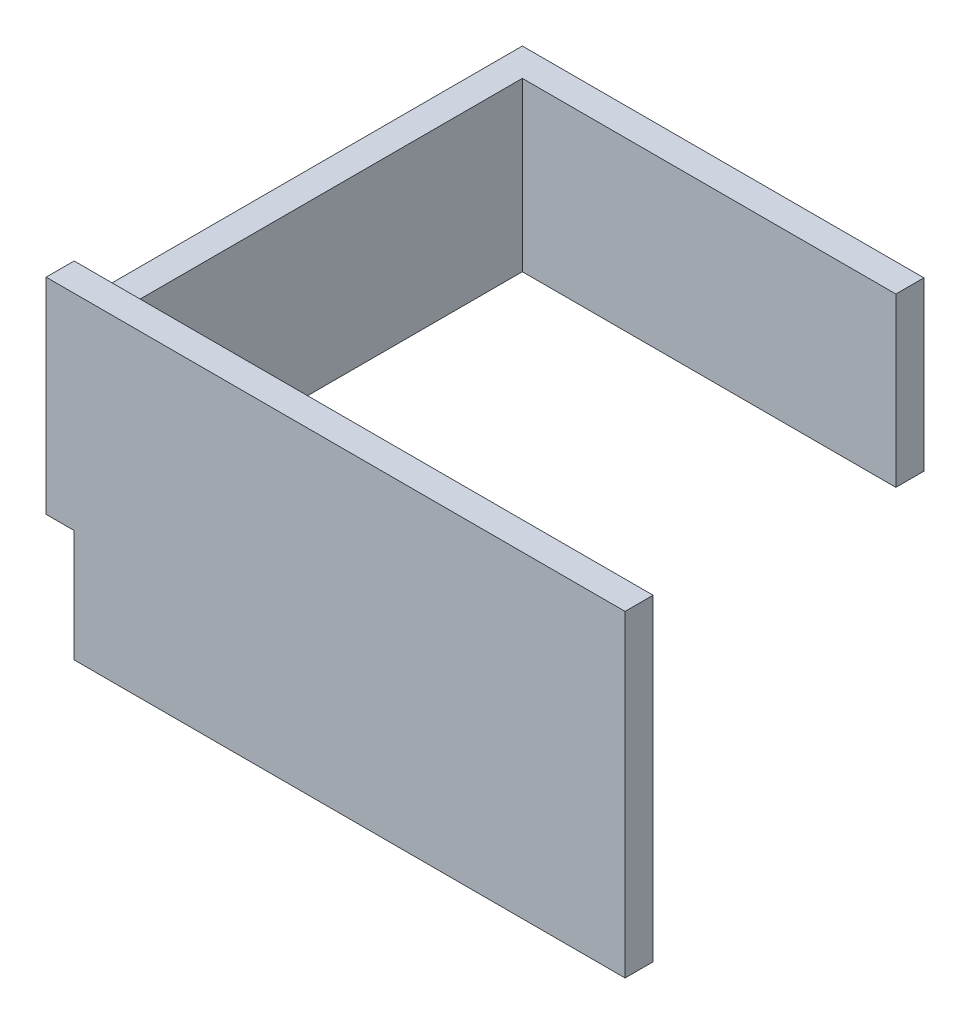
ISO-10303-21;
HEADER;
FILE_DESCRIPTION(('STEP AP214'),'2;1');
FILE_NAME('part.step','',(''),(''),'','','');
FILE_SCHEMA(('AUTOMOTIVE_DESIGN { 1 0 10303 214 1 1 1 1 }'));
ENDSEC;
DATA;
#1=APPLICATION_CONTEXT('core data for automotive mechanical design processes');
#2=APPLICATION_PROTOCOL_DEFINITION('international standard','automotive_design',2000,#1);
#3=PRODUCT_CONTEXT('',#1,'mechanical');
#4=PRODUCT('Part','Part','',(#3));
#5=PRODUCT_RELATED_PRODUCT_CATEGORY('part','',(#4));
#6=PRODUCT_DEFINITION_FORMATION('','',#4);
#7=PRODUCT_DEFINITION_CONTEXT('part definition',#1,'design');
#8=PRODUCT_DEFINITION('design','',#6,#7);
#9=PRODUCT_DEFINITION_SHAPE('','',#8);
#10=(LENGTH_UNIT() NAMED_UNIT(*) SI_UNIT(.MILLI.,.METRE.));
#11=(NAMED_UNIT(*) PLANE_ANGLE_UNIT() SI_UNIT($,.RADIAN.));
#12=(NAMED_UNIT(*) SI_UNIT($,.STERADIAN.) SOLID_ANGLE_UNIT());
#13=UNCERTAINTY_MEASURE_WITH_UNIT(LENGTH_MEASURE(1.E-05),#10,'distance_accuracy_value','');
#14=(GEOMETRIC_REPRESENTATION_CONTEXT(3) GLOBAL_UNCERTAINTY_ASSIGNED_CONTEXT((#13)) GLOBAL_UNIT_ASSIGNED_CONTEXT((#10,
#11,#12)) REPRESENTATION_CONTEXT('',''));
#15=CARTESIAN_POINT('',(0.,0.,0.));
#16=DIRECTION('',(0.,0.,1.));
#17=DIRECTION('',(1.,0.,0.));
#18=AXIS2_PLACEMENT_3D('',#15,#16,#17);
#19=CARTESIAN_POINT('',(0.,34.,0.));
#20=DIRECTION('',(1.,0.,0.));
#21=DIRECTION('',(0.,0.,-1.));
#22=AXIS2_PLACEMENT_3D('',#19,#20,#21);
#23=PLANE('',#22);
#24=DIRECTION('',(0.,-1.,0.));
#25=VECTOR('',#24,1.);
#26=CARTESIAN_POINT('',(0.,34.,3.));
#27=LINE('',#26,#25);
#28=CARTESIAN_POINT('',(0.,12.,3.));
#29=VERTEX_POINT('',#28);
#30=CARTESIAN_POINT('',(0.,0.,3.));
#31=VERTEX_POINT('',#30);
#32=EDGE_CURVE('E127',#29,#31,#27,.T.);
#33=ORIENTED_EDGE('',*,*,#32,.F.);
#34=DIRECTION('',(0.,0.,-1.));
#35=VECTOR('',#34,1.);
#36=CARTESIAN_POINT('',(0.,12.,3.));
#37=LINE('',#36,#35);
#38=CARTESIAN_POINT('',(0.,12.,0.));
#39=VERTEX_POINT('',#38);
#40=EDGE_CURVE('E153',#29,#39,#37,.T.);
#41=ORIENTED_EDGE('',*,*,#40,.T.);
#42=DIRECTION('',(0.,-1.,0.));
#43=VECTOR('',#42,1.);
#44=CARTESIAN_POINT('',(0.,34.,0.));
#45=LINE('',#44,#43);
#46=CARTESIAN_POINT('',(0.,0.,0.));
#47=VERTEX_POINT('',#46);
#48=EDGE_CURVE('E178',#39,#47,#45,.T.);
#49=ORIENTED_EDGE('',*,*,#48,.T.);
#50=DIRECTION('',(0.,0.,1.));
#51=VECTOR('',#50,1.);
#52=CARTESIAN_POINT('',(0.,0.,0.));
#53=LINE('',#52,#51);
#54=EDGE_CURVE('E168',#47,#31,#53,.T.);
#55=ORIENTED_EDGE('',*,*,#54,.T.);
#56=EDGE_LOOP('',(#33,#41,#49,#55));
#57=FACE_BOUND('',#56,.T.);
#58=ADVANCED_FACE('F41',(#57),#23,.F.);
#59=CARTESIAN_POINT('',(0.,34.,3.));
#60=DIRECTION('',(0.,0.,-1.));
#61=DIRECTION('',(-1.,0.,0.));
#62=AXIS2_PLACEMENT_3D('',#59,#60,#61);
#63=PLANE('',#62);
#64=DIRECTION('',(1.,0.,0.));
#65=VECTOR('',#64,1.);
#66=CARTESIAN_POINT('',(0.,0.,3.));
#67=LINE('',#66,#65);
#68=CARTESIAN_POINT('',(59.,0.,3.));
#69=VERTEX_POINT('',#68);
#70=EDGE_CURVE('E181',#31,#69,#67,.T.);
#71=ORIENTED_EDGE('',*,*,#70,.T.);
#72=DIRECTION('',(0.,-1.,0.));
#73=VECTOR('',#72,1.);
#74=CARTESIAN_POINT('',(59.,34.,3.));
#75=LINE('',#74,#73);
#76=CARTESIAN_POINT('',(59.,34.,3.));
#77=VERTEX_POINT('',#76);
#78=EDGE_CURVE('E191',#77,#69,#75,.T.);
#79=ORIENTED_EDGE('',*,*,#78,.F.);
#80=DIRECTION('',(1.,0.,0.));
#81=VECTOR('',#80,1.);
#82=CARTESIAN_POINT('',(0.,34.,3.));
#83=LINE('',#82,#81);
#84=CARTESIAN_POINT('',(-3.,34.,3.));
#85=VERTEX_POINT('',#84);
#86=EDGE_CURVE('E171',#85,#77,#83,.T.);
#87=ORIENTED_EDGE('',*,*,#86,.F.);
#88=DIRECTION('',(0.,1.,0.));
#89=VECTOR('',#88,1.);
#90=CARTESIAN_POINT('',(-3.,12.,3.));
#91=LINE('',#90,#89);
#92=CARTESIAN_POINT('',(-3.,12.,3.));
#93=VERTEX_POINT('',#92);
#94=EDGE_CURVE('E165',#93,#85,#91,.T.);
#95=ORIENTED_EDGE('',*,*,#94,.F.);
#96=DIRECTION('',(1.,0.,0.));
#97=VECTOR('',#96,1.);
#98=CARTESIAN_POINT('',(0.,12.,3.));
#99=LINE('',#98,#97);
#100=EDGE_CURVE('E160',#93,#29,#99,.T.);
#101=ORIENTED_EDGE('',*,*,#100,.T.);
#102=ORIENTED_EDGE('',*,*,#32,.T.);
#103=EDGE_LOOP('',(#71,#79,#87,#95,#101,#102));
#104=FACE_BOUND('',#103,.T.);
#105=ADVANCED_FACE('F197',(#104),#63,.F.);
#106=CARTESIAN_POINT('',(59.,34.,0.));
#107=DIRECTION('',(-1.,0.,0.));
#108=DIRECTION('',(0.,0.,1.));
#109=AXIS2_PLACEMENT_3D('',#106,#107,#108);
#110=PLANE('',#109);
#111=DIRECTION('',(0.,0.,-1.));
#112=VECTOR('',#111,1.);
#113=CARTESIAN_POINT('',(59.,0.,0.));
#114=LINE('',#113,#112);
#115=CARTESIAN_POINT('',(59.,0.,0.));
#116=VERTEX_POINT('',#115);
#117=EDGE_CURVE('E183',#69,#116,#114,.T.);
#118=ORIENTED_EDGE('',*,*,#117,.T.);
#119=DIRECTION('',(0.,-1.,0.));
#120=VECTOR('',#119,1.);
#121=CARTESIAN_POINT('',(59.,34.,0.));
#122=LINE('',#121,#120);
#123=CARTESIAN_POINT('',(59.,34.,0.));
#124=VERTEX_POINT('',#123);
#125=EDGE_CURVE('E188',#124,#116,#122,.T.);
#126=ORIENTED_EDGE('',*,*,#125,.F.);
#127=DIRECTION('',(0.,0.,-1.));
#128=VECTOR('',#127,1.);
#129=CARTESIAN_POINT('',(59.,34.,0.));
#130=LINE('',#129,#128);
#131=EDGE_CURVE('E173',#77,#124,#130,.T.);
#132=ORIENTED_EDGE('',*,*,#131,.F.);
#133=ORIENTED_EDGE('',*,*,#78,.T.);
#134=EDGE_LOOP('',(#118,#126,#132,#133));
#135=FACE_BOUND('',#134,.T.);
#136=ADVANCED_FACE('F213',(#135),#110,.F.);
#137=CARTESIAN_POINT('',(0.,34.,0.));
#138=DIRECTION('',(0.,0.,1.));
#139=DIRECTION('',(1.,0.,0.));
#140=AXIS2_PLACEMENT_3D('',#137,#138,#139);
#141=PLANE('',#140);
#142=CARTESIAN_POINT('',(0.,29.935597978221,0.));
#143=VERTEX_POINT('',#142);
#144=EDGE_CURVE('E63',#143,#39,#45,.T.);
#145=ORIENTED_EDGE('',*,*,#144,.F.);
#146=DIRECTION('',(1.,0.,0.));
#147=VECTOR('',#146,1.);
#148=CARTESIAN_POINT('',(-49.,29.935597978221,0.));
#149=LINE('',#148,#147);
#150=CARTESIAN_POINT('',(-3.,29.935597978221,0.));
#151=VERTEX_POINT('',#150);
#152=EDGE_CURVE('E136',#151,#143,#149,.T.);
#153=ORIENTED_EDGE('',*,*,#152,.F.);
#154=DIRECTION('',(0.,1.,0.));
#155=VECTOR('',#154,1.);
#156=CARTESIAN_POINT('',(-3.,12.,0.));
#157=LINE('',#156,#155);
#158=CARTESIAN_POINT('',(-3.,34.,0.));
#159=VERTEX_POINT('',#158);
#160=EDGE_CURVE('E11',#151,#159,#157,.T.);
#161=ORIENTED_EDGE('',*,*,#160,.T.);
#162=DIRECTION('',(-1.,0.,0.));
#163=VECTOR('',#162,1.);
#164=CARTESIAN_POINT('',(0.,34.,0.));
#165=LINE('',#164,#163);
#166=EDGE_CURVE('E176',#124,#159,#165,.T.);
#167=ORIENTED_EDGE('',*,*,#166,.F.);
#168=ORIENTED_EDGE('',*,*,#125,.T.);
#169=DIRECTION('',(-1.,0.,0.));
#170=VECTOR('',#169,1.);
#171=CARTESIAN_POINT('',(0.,0.,0.));
#172=LINE('',#171,#170);
#173=EDGE_CURVE('E174',#116,#47,#172,.T.);
#174=ORIENTED_EDGE('',*,*,#173,.T.);
#175=ORIENTED_EDGE('',*,*,#48,.F.);
#176=EDGE_LOOP('',(#145,#153,#161,#167,#168,#174,#175));
#177=FACE_BOUND('',#176,.T.);
#178=ADVANCED_FACE('F208',(#177),#141,.F.);
#179=CARTESIAN_POINT('',(0.,34.,0.));
#180=DIRECTION('',(0.,1.,0.));
#181=DIRECTION('',(0.,0.,1.));
#182=AXIS2_PLACEMENT_3D('',#179,#180,#181);
#183=PLANE('',#182);
#184=ORIENTED_EDGE('',*,*,#166,.T.);
#185=DIRECTION('',(0.,0.,1.));
#186=VECTOR('',#185,1.);
#187=CARTESIAN_POINT('',(-3.,34.,3.));
#188=LINE('',#187,#186);
#189=EDGE_CURVE('E151',#159,#85,#188,.T.);
#190=ORIENTED_EDGE('',*,*,#189,.T.);
#191=ORIENTED_EDGE('',*,*,#86,.T.);
#192=ORIENTED_EDGE('',*,*,#131,.T.);
#193=EDGE_LOOP('',(#184,#190,#191,#192));
#194=FACE_BOUND('',#193,.T.);
#195=ADVANCED_FACE('F255',(#194),#183,.T.);
#196=CARTESIAN_POINT('',(0.,0.,0.));
#197=DIRECTION('',(0.,1.,0.));
#198=DIRECTION('',(0.,0.,1.));
#199=AXIS2_PLACEMENT_3D('',#196,#197,#198);
#200=PLANE('',#199);
#201=ORIENTED_EDGE('',*,*,#54,.F.);
#202=ORIENTED_EDGE('',*,*,#173,.F.);
#203=ORIENTED_EDGE('',*,*,#117,.F.);
#204=ORIENTED_EDGE('',*,*,#70,.F.);
#205=EDGE_LOOP('',(#201,#202,#203,#204));
#206=FACE_BOUND('',#205,.T.);
#207=ADVANCED_FACE('F204',(#206),#200,.F.);
#208=CARTESIAN_POINT('',(0.,12.,3.));
#209=DIRECTION('',(1.,0.,0.));
#210=DIRECTION('',(0.,0.,-1.));
#211=AXIS2_PLACEMENT_3D('',#208,#209,#210);
#212=PLANE('',#211);
#213=DIRECTION('',(0.,0.,-1.));
#214=VECTOR('',#213,1.);
#215=CARTESIAN_POINT('',(0.,29.935597978221,3.));
#216=LINE('',#215,#214);
#217=CARTESIAN_POINT('',(0.,29.935597978221,-45.));
#218=VERTEX_POINT('',#217);
#219=EDGE_CURVE('E224',#143,#218,#216,.T.);
#220=ORIENTED_EDGE('',*,*,#219,.F.);
#221=ORIENTED_EDGE('',*,*,#144,.T.);
#222=CARTESIAN_POINT('',(0.,12.,-45.));
#223=VERTEX_POINT('',#222);
#224=EDGE_CURVE('E157',#39,#223,#37,.T.);
#225=ORIENTED_EDGE('',*,*,#224,.T.);
#226=DIRECTION('',(0.,1.,0.));
#227=VECTOR('',#226,1.);
#228=CARTESIAN_POINT('',(0.,12.,-45.));
#229=LINE('',#228,#227);
#230=EDGE_CURVE('E163',#223,#218,#229,.T.);
#231=ORIENTED_EDGE('',*,*,#230,.T.);
#232=EDGE_LOOP('',(#220,#221,#225,#231));
#233=FACE_BOUND('',#232,.T.);
#234=ADVANCED_FACE('F223',(#233),#212,.T.);
#235=CARTESIAN_POINT('',(-3.,12.,3.));
#236=DIRECTION('',(-1.,0.,0.));
#237=DIRECTION('',(0.,0.,1.));
#238=AXIS2_PLACEMENT_3D('',#235,#236,#237);
#239=PLANE('',#238);
#240=DIRECTION('',(0.,0.,1.));
#241=VECTOR('',#240,1.);
#242=CARTESIAN_POINT('',(-3.,29.935597978221,3.));
#243=LINE('',#242,#241);
#244=CARTESIAN_POINT('',(-3.,29.935597978221,-48.));
#245=VERTEX_POINT('',#244);
#246=EDGE_CURVE('E144',#245,#151,#243,.T.);
#247=ORIENTED_EDGE('',*,*,#246,.F.);
#248=DIRECTION('',(0.,1.,0.));
#249=VECTOR('',#248,1.);
#250=CARTESIAN_POINT('',(-3.,-31.1045241245046,-48.));
#251=LINE('',#250,#249);
#252=CARTESIAN_POINT('',(-3.,12.,-48.));
#253=VERTEX_POINT('',#252);
#254=EDGE_CURVE('E135',#253,#245,#251,.T.);
#255=ORIENTED_EDGE('',*,*,#254,.F.);
#256=DIRECTION('',(0.,0.,1.));
#257=VECTOR('',#256,1.);
#258=CARTESIAN_POINT('',(-3.,12.,3.));
#259=LINE('',#258,#257);
#260=EDGE_CURVE('E156',#253,#93,#259,.T.);
#261=ORIENTED_EDGE('',*,*,#260,.T.);
#262=ORIENTED_EDGE('',*,*,#94,.T.);
#263=ORIENTED_EDGE('',*,*,#189,.F.);
#264=ORIENTED_EDGE('',*,*,#160,.F.);
#265=EDGE_LOOP('',(#247,#255,#261,#262,#263,#264));
#266=FACE_BOUND('',#265,.T.);
#267=ADVANCED_FACE('F218',(#266),#239,.T.);
#268=CARTESIAN_POINT('',(0.,12.,0.));
#269=DIRECTION('',(0.,1.,0.));
#270=DIRECTION('',(0.,0.,1.));
#271=AXIS2_PLACEMENT_3D('',#268,#269,#270);
#272=PLANE('',#271);
#273=ORIENTED_EDGE('',*,*,#40,.F.);
#274=ORIENTED_EDGE('',*,*,#100,.F.);
#275=ORIENTED_EDGE('',*,*,#260,.F.);
#276=DIRECTION('',(1.,0.,0.));
#277=VECTOR('',#276,1.);
#278=CARTESIAN_POINT('',(-3.,12.,-48.));
#279=LINE('',#278,#277);
#280=CARTESIAN_POINT('',(40.,12.,-48.));
#281=VERTEX_POINT('',#280);
#282=EDGE_CURVE('E152',#253,#281,#279,.T.);
#283=ORIENTED_EDGE('',*,*,#282,.T.);
#284=DIRECTION('',(0.,0.,1.));
#285=VECTOR('',#284,1.);
#286=CARTESIAN_POINT('',(40.,12.,-45.));
#287=LINE('',#286,#285);
#288=CARTESIAN_POINT('',(40.,12.,-45.));
#289=VERTEX_POINT('',#288);
#290=EDGE_CURVE('E140',#281,#289,#287,.T.);
#291=ORIENTED_EDGE('',*,*,#290,.T.);
#292=DIRECTION('',(-1.,0.,0.));
#293=VECTOR('',#292,1.);
#294=CARTESIAN_POINT('',(-3.,12.,-45.));
#295=LINE('',#294,#293);
#296=EDGE_CURVE('E148',#289,#223,#295,.T.);
#297=ORIENTED_EDGE('',*,*,#296,.T.);
#298=ORIENTED_EDGE('',*,*,#224,.F.);
#299=EDGE_LOOP('',(#273,#274,#275,#283,#291,#297,#298));
#300=FACE_BOUND('',#299,.T.);
#301=ADVANCED_FACE('F221',(#300),#272,.F.);
#302=CARTESIAN_POINT('',(-3.,-31.1045241245046,-45.));
#303=DIRECTION('',(0.,0.,1.));
#304=DIRECTION('',(1.,0.,0.));
#305=AXIS2_PLACEMENT_3D('',#302,#303,#304);
#306=PLANE('',#305);
#307=DIRECTION('',(1.,0.,0.));
#308=VECTOR('',#307,1.);
#309=CARTESIAN_POINT('',(-3.,29.935597978221,-45.));
#310=LINE('',#309,#308);
#311=CARTESIAN_POINT('',(40.,29.935597978221,-45.));
#312=VERTEX_POINT('',#311);
#313=EDGE_CURVE('E55',#218,#312,#310,.T.);
#314=ORIENTED_EDGE('',*,*,#313,.F.);
#315=ORIENTED_EDGE('',*,*,#230,.F.);
#316=ORIENTED_EDGE('',*,*,#296,.F.);
#317=DIRECTION('',(0.,1.,0.));
#318=VECTOR('',#317,1.);
#319=CARTESIAN_POINT('',(40.,-31.1045241245046,-45.));
#320=LINE('',#319,#318);
#321=EDGE_CURVE('E141',#289,#312,#320,.T.);
#322=ORIENTED_EDGE('',*,*,#321,.T.);
#323=EDGE_LOOP('',(#314,#315,#316,#322));
#324=FACE_BOUND('',#323,.T.);
#325=ADVANCED_FACE('F226',(#324),#306,.T.);
#326=CARTESIAN_POINT('',(-3.,-31.1045241245046,-48.));
#327=DIRECTION('',(0.,0.,-1.));
#328=DIRECTION('',(-1.,0.,0.));
#329=AXIS2_PLACEMENT_3D('',#326,#327,#328);
#330=PLANE('',#329);
#331=DIRECTION('',(1.,0.,0.));
#332=VECTOR('',#331,1.);
#333=CARTESIAN_POINT('',(-49.,29.935597978221,-48.));
#334=LINE('',#333,#332);
#335=CARTESIAN_POINT('',(40.,29.935597978221,-48.));
#336=VERTEX_POINT('',#335);
#337=EDGE_CURVE('E121',#245,#336,#334,.T.);
#338=ORIENTED_EDGE('',*,*,#337,.T.);
#339=DIRECTION('',(0.,1.,0.));
#340=VECTOR('',#339,1.);
#341=CARTESIAN_POINT('',(40.,-31.1045241245046,-48.));
#342=LINE('',#341,#340);
#343=EDGE_CURVE('E133',#281,#336,#342,.T.);
#344=ORIENTED_EDGE('',*,*,#343,.F.);
#345=ORIENTED_EDGE('',*,*,#282,.F.);
#346=ORIENTED_EDGE('',*,*,#254,.T.);
#347=EDGE_LOOP('',(#338,#344,#345,#346));
#348=FACE_BOUND('',#347,.T.);
#349=ADVANCED_FACE('F131',(#348),#330,.T.);
#350=CARTESIAN_POINT('',(40.,-31.1045241245046,-45.));
#351=DIRECTION('',(1.,0.,0.));
#352=DIRECTION('',(0.,0.,-1.));
#353=AXIS2_PLACEMENT_3D('',#350,#351,#352);
#354=PLANE('',#353);
#355=DIRECTION('',(0.,0.,-1.));
#356=VECTOR('',#355,1.);
#357=CARTESIAN_POINT('',(40.,29.935597978221,-45.));
#358=LINE('',#357,#356);
#359=EDGE_CURVE('E48',#312,#336,#358,.T.);
#360=ORIENTED_EDGE('',*,*,#359,.F.);
#361=ORIENTED_EDGE('',*,*,#321,.F.);
#362=ORIENTED_EDGE('',*,*,#290,.F.);
#363=ORIENTED_EDGE('',*,*,#343,.T.);
#364=EDGE_LOOP('',(#360,#361,#362,#363));
#365=FACE_BOUND('',#364,.T.);
#366=ADVANCED_FACE('F139',(#365),#354,.T.);
#367=CARTESIAN_POINT('',(-49.,29.935597978221,-48.));
#368=DIRECTION('',(0.,-1.,0.));
#369=DIRECTION('',(0.,0.,-1.));
#370=AXIS2_PLACEMENT_3D('',#367,#368,#369);
#371=PLANE('',#370);
#372=ORIENTED_EDGE('',*,*,#246,.T.);
#373=ORIENTED_EDGE('',*,*,#152,.T.);
#374=ORIENTED_EDGE('',*,*,#219,.T.);
#375=ORIENTED_EDGE('',*,*,#313,.T.);
#376=ORIENTED_EDGE('',*,*,#359,.T.);
#377=ORIENTED_EDGE('',*,*,#337,.F.);
#378=EDGE_LOOP('',(#372,#373,#374,#375,#376,#377));
#379=FACE_BOUND('',#378,.T.);
#380=ADVANCED_FACE('F120',(#379),#371,.F.);
#381=CLOSED_SHELL('',(#58,#105,#136,#178,#195,#207,#234,#267,#301,#325,#349,#366,#380));
#382=MANIFOLD_SOLID_BREP('B2',#381);
#383=ADVANCED_BREP_SHAPE_REPRESENTATION('',(#18,#382),#14);
#384=SHAPE_DEFINITION_REPRESENTATION(#9,#383);
ENDSEC;
END-ISO-10303-21;
